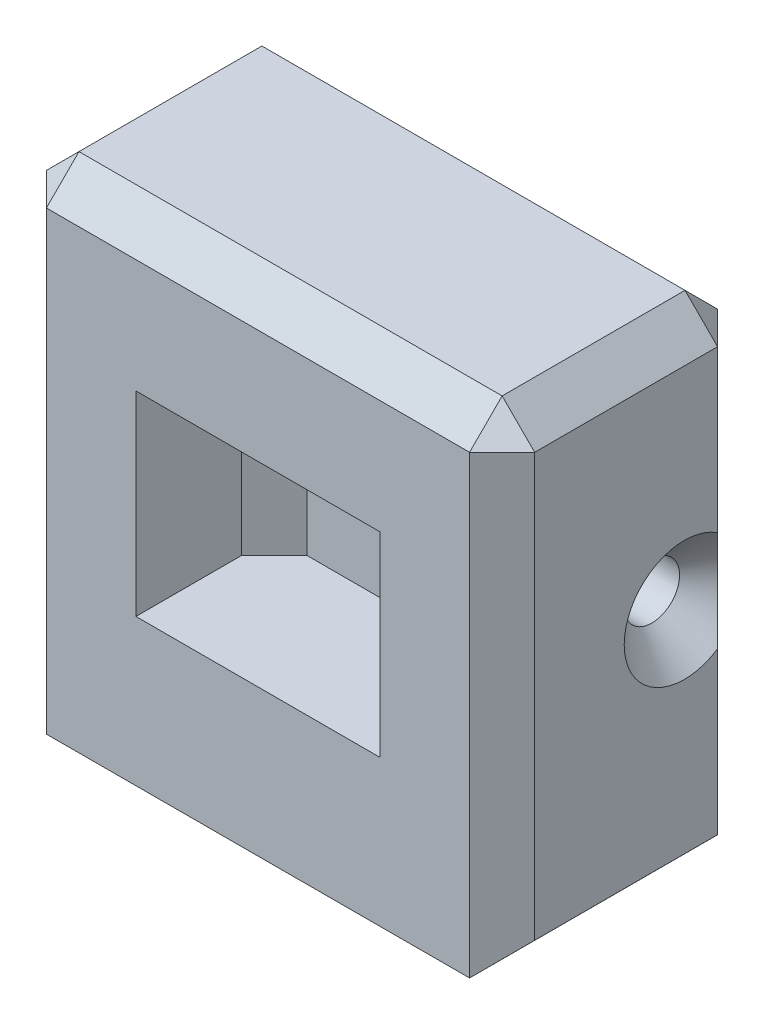
ISO-10303-21;
HEADER;
FILE_DESCRIPTION(('STEP AP214'),'2;1');
FILE_NAME('part.step','',(''),(''),'','','');
FILE_SCHEMA(('AUTOMOTIVE_DESIGN { 1 0 10303 214 1 1 1 1 }'));
ENDSEC;
DATA;
#1=APPLICATION_CONTEXT('core data for automotive mechanical design processes');
#2=APPLICATION_PROTOCOL_DEFINITION('international standard','automotive_design',2000,#1);
#3=PRODUCT_CONTEXT('',#1,'mechanical');
#4=PRODUCT('Part','Part','',(#3));
#5=PRODUCT_RELATED_PRODUCT_CATEGORY('part','',(#4));
#6=PRODUCT_DEFINITION_FORMATION('','',#4);
#7=PRODUCT_DEFINITION_CONTEXT('part definition',#1,'design');
#8=PRODUCT_DEFINITION('design','',#6,#7);
#9=PRODUCT_DEFINITION_SHAPE('','',#8);
#10=(LENGTH_UNIT() NAMED_UNIT(*) SI_UNIT(.MILLI.,.METRE.));
#11=(NAMED_UNIT(*) PLANE_ANGLE_UNIT() SI_UNIT($,.RADIAN.));
#12=(NAMED_UNIT(*) SI_UNIT($,.STERADIAN.) SOLID_ANGLE_UNIT());
#13=UNCERTAINTY_MEASURE_WITH_UNIT(LENGTH_MEASURE(1.E-05),#10,'distance_accuracy_value','');
#14=(GEOMETRIC_REPRESENTATION_CONTEXT(3) GLOBAL_UNCERTAINTY_ASSIGNED_CONTEXT((#13)) GLOBAL_UNIT_ASSIGNED_CONTEXT((#10,
#11,#12)) REPRESENTATION_CONTEXT('',''));
#15=CARTESIAN_POINT('',(0.,0.,0.));
#16=DIRECTION('',(0.,0.,1.));
#17=DIRECTION('',(1.,0.,0.));
#18=AXIS2_PLACEMENT_3D('',#15,#16,#17);
#19=CARTESIAN_POINT('',(12.7,72.39,-22.184499954));
#20=DIRECTION('',(0.,1.,0.));
#21=DIRECTION('',(0.,0.,1.));
#22=AXIS2_PLACEMENT_3D('',#19,#20,#21);
#23=PLANE('',#22);
#24=DIRECTION('',(0.,0.,1.));
#25=VECTOR('',#24,1.);
#26=CARTESIAN_POINT('',(-3.80999999999998,72.39,21.59));
#27=LINE('',#26,#25);
#28=CARTESIAN_POINT('',(-3.80999999999998,72.39,4.77834388084319));
#29=VERTEX_POINT('',#28);
#30=CARTESIAN_POINT('',(-3.80999999999998,72.39,19.05));
#31=VERTEX_POINT('',#30);
#32=EDGE_CURVE('E59',#29,#31,#27,.T.);
#33=ORIENTED_EDGE('',*,*,#32,.T.);
#34=DIRECTION('',(1.,0.,0.));
#35=VECTOR('',#34,1.);
#36=CARTESIAN_POINT('',(31.75,72.39,19.05));
#37=LINE('',#36,#35);
#38=CARTESIAN_POINT('',(29.21,72.39,19.05));
#39=VERTEX_POINT('',#38);
#40=EDGE_CURVE('E11',#31,#39,#37,.T.);
#41=ORIENTED_EDGE('',*,*,#40,.T.);
#42=DIRECTION('',(0.,0.,-1.));
#43=VECTOR('',#42,1.);
#44=CARTESIAN_POINT('',(29.21,72.39,2.23834388084317));
#45=LINE('',#44,#43);
#46=CARTESIAN_POINT('',(29.21,72.39,4.77834388084319));
#47=VERTEX_POINT('',#46);
#48=EDGE_CURVE('E417',#39,#47,#45,.T.);
#49=ORIENTED_EDGE('',*,*,#48,.T.);
#50=DIRECTION('',(-1.,0.,0.));
#51=VECTOR('',#50,1.);
#52=CARTESIAN_POINT('',(12.7,72.39,4.77834388084319));
#53=LINE('',#52,#51);
#54=EDGE_CURVE('E70',#47,#29,#53,.T.);
#55=ORIENTED_EDGE('',*,*,#54,.T.);
#56=EDGE_LOOP('',(#33,#41,#49,#55));
#57=FACE_BOUND('',#56,.T.);
#58=ADVANCED_FACE('F48',(#57),#23,.T.);
#59=CARTESIAN_POINT('',(31.75,0.,0.));
#60=DIRECTION('',(-1.,0.,0.));
#61=DIRECTION('',(0.,0.,1.));
#62=AXIS2_PLACEMENT_3D('',#59,#60,#61);
#63=PLANE('',#62);
#64=DIRECTION('',(0.,0.,-1.));
#65=VECTOR('',#64,1.);
#66=CARTESIAN_POINT('',(31.75,36.8695550611985,0.));
#67=LINE('',#66,#65);
#68=CARTESIAN_POINT('',(31.75,36.8695550611985,19.05));
#69=VERTEX_POINT('',#68);
#70=CARTESIAN_POINT('',(31.75,36.8695550611985,4.77834388084317));
#71=VERTEX_POINT('',#70);
#72=EDGE_CURVE('E388',#69,#71,#67,.T.);
#73=ORIENTED_EDGE('',*,*,#72,.T.);
#74=DIRECTION('',(0.,1.,0.));
#75=VECTOR('',#74,1.);
#76=CARTESIAN_POINT('',(31.75,72.39,4.77834388084317));
#77=LINE('',#76,#75);
#78=CARTESIAN_POINT('',(31.75,49.4362143078983,4.77834388084317));
#79=VERTEX_POINT('',#78);
#80=EDGE_CURVE('E392',#71,#79,#77,.T.);
#81=ORIENTED_EDGE('',*,*,#80,.T.);
#82=CARTESIAN_POINT('',(31.75,53.3585397417437,7.366));
#83=DIRECTION('',(-1.,0.,0.));
#84=DIRECTION('',(0.,0.,1.));
#85=AXIS2_PLACEMENT_3D('',#82,#83,#84);
#86=CIRCLE('',#85,4.69900000000002);
#87=CARTESIAN_POINT('',(31.75,53.3585397417437,12.065));
#88=VERTEX_POINT('',#87);
#89=EDGE_CURVE('E385',#79,#88,#86,.T.);
#90=ORIENTED_EDGE('',*,*,#89,.T.);
#91=CARTESIAN_POINT('',(31.75,53.3585397417437,7.366));
#92=DIRECTION('',(-1.,0.,0.));
#93=DIRECTION('',(0.,0.,1.));
#94=AXIS2_PLACEMENT_3D('',#91,#92,#93);
#95=CIRCLE('',#94,4.69900000000002);
#96=CARTESIAN_POINT('',(31.75,57.2808651755891,4.77834388084317));
#97=VERTEX_POINT('',#96);
#98=EDGE_CURVE('E382',#88,#97,#95,.T.);
#99=ORIENTED_EDGE('',*,*,#98,.T.);
#100=DIRECTION('',(0.,1.,0.));
#101=VECTOR('',#100,1.);
#102=CARTESIAN_POINT('',(31.75,72.39,4.77834388084317));
#103=LINE('',#102,#101);
#104=CARTESIAN_POINT('',(31.75,69.85,4.77834388084317));
#105=VERTEX_POINT('',#104);
#106=EDGE_CURVE('E376',#97,#105,#103,.T.);
#107=ORIENTED_EDGE('',*,*,#106,.T.);
#108=DIRECTION('',(0.,0.,1.));
#109=VECTOR('',#108,1.);
#110=CARTESIAN_POINT('',(31.75,69.85,21.59));
#111=LINE('',#110,#109);
#112=CARTESIAN_POINT('',(31.75,69.85,19.05));
#113=VERTEX_POINT('',#112);
#114=EDGE_CURVE('E373',#105,#113,#111,.T.);
#115=ORIENTED_EDGE('',*,*,#114,.T.);
#116=DIRECTION('',(0.,-1.,0.));
#117=VECTOR('',#116,1.);
#118=CARTESIAN_POINT('',(31.75,0.,19.05));
#119=LINE('',#118,#117);
#120=EDGE_CURVE('E379',#113,#69,#119,.T.);
#121=ORIENTED_EDGE('',*,*,#120,.T.);
#122=EDGE_LOOP('',(#73,#81,#90,#99,#107,#115,#121));
#123=FACE_BOUND('',#122,.T.);
#124=ADVANCED_FACE('F564',(#123),#63,.F.);
#125=CARTESIAN_POINT('',(-6.35,0.,0.));
#126=DIRECTION('',(1.,0.,0.));
#127=DIRECTION('',(0.,0.,-1.));
#128=AXIS2_PLACEMENT_3D('',#125,#126,#127);
#129=PLANE('',#128);
#130=CARTESIAN_POINT('',(-6.35,53.3585397417437,7.366));
#131=DIRECTION('',(1.,0.,0.));
#132=DIRECTION('',(0.,0.,-1.));
#133=AXIS2_PLACEMENT_3D('',#130,#131,#132);
#134=CIRCLE('',#133,4.69899999999999);
#135=CARTESIAN_POINT('',(-6.35,57.2808651755891,4.77834388084319));
#136=VERTEX_POINT('',#135);
#137=CARTESIAN_POINT('',(-6.35,49.4362143078983,4.77834388084319));
#138=VERTEX_POINT('',#137);
#139=EDGE_CURVE('E359',#136,#138,#134,.T.);
#140=ORIENTED_EDGE('',*,*,#139,.T.);
#141=DIRECTION('',(0.,-1.,0.));
#142=VECTOR('',#141,1.);
#143=CARTESIAN_POINT('',(-6.35,34.29,4.77834388084319));
#144=LINE('',#143,#142);
#145=CARTESIAN_POINT('',(-6.35,36.83,4.77834388084319));
#146=VERTEX_POINT('',#145);
#147=EDGE_CURVE('E366',#138,#146,#144,.T.);
#148=ORIENTED_EDGE('',*,*,#147,.T.);
#149=DIRECTION('',(0.,0.,1.));
#150=VECTOR('',#149,1.);
#151=CARTESIAN_POINT('',(-6.35,36.83,0.));
#152=LINE('',#151,#150);
#153=CARTESIAN_POINT('',(-6.35,36.83,19.05));
#154=VERTEX_POINT('',#153);
#155=EDGE_CURVE('E362',#146,#154,#152,.T.);
#156=ORIENTED_EDGE('',*,*,#155,.T.);
#157=DIRECTION('',(0.,1.,0.));
#158=VECTOR('',#157,1.);
#159=CARTESIAN_POINT('',(-6.35,0.,19.05));
#160=LINE('',#159,#158);
#161=CARTESIAN_POINT('',(-6.35,69.85,19.05));
#162=VERTEX_POINT('',#161);
#163=EDGE_CURVE('E356',#154,#162,#160,.T.);
#164=ORIENTED_EDGE('',*,*,#163,.T.);
#165=DIRECTION('',(0.,0.,-1.));
#166=VECTOR('',#165,1.);
#167=CARTESIAN_POINT('',(-6.35,69.85,2.23834388084317));
#168=LINE('',#167,#166);
#169=CARTESIAN_POINT('',(-6.35,69.85,4.77834388084319));
#170=VERTEX_POINT('',#169);
#171=EDGE_CURVE('E350',#162,#170,#168,.T.);
#172=ORIENTED_EDGE('',*,*,#171,.T.);
#173=DIRECTION('',(0.,-1.,0.));
#174=VECTOR('',#173,1.);
#175=CARTESIAN_POINT('',(-6.35,34.29,4.77834388084319));
#176=LINE('',#175,#174);
#177=EDGE_CURVE('E353',#170,#136,#176,.T.);
#178=ORIENTED_EDGE('',*,*,#177,.T.);
#179=EDGE_LOOP('',(#140,#148,#156,#164,#172,#178));
#180=FACE_BOUND('',#179,.T.);
#181=ADVANCED_FACE('F632',(#180),#129,.F.);
#182=CARTESIAN_POINT('',(31.75,34.3270794834874,21.59));
#183=DIRECTION('',(-0.000973214328807074,0.999999526426823,0.));
#184=DIRECTION('',(-0.999999526426823,-0.000973214328807074,0.));
#185=AXIS2_PLACEMENT_3D('',#182,#183,#184);
#186=PLANE('',#185);
#187=DIRECTION('',(-0.999999526426823,-0.000973214328807074,0.));
#188=VECTOR('',#187,1.);
#189=CARTESIAN_POINT('',(31.75,34.3270794834874,2.23834388084317));
#190=LINE('',#189,#188);
#191=CARTESIAN_POINT('',(29.21,34.3246075179216,2.23834388084317));
#192=VERTEX_POINT('',#191);
#193=CARTESIAN_POINT('',(-3.81000000000001,34.2924719655658,2.23834388084317));
#194=VERTEX_POINT('',#193);
#195=EDGE_CURVE('E333',#192,#194,#190,.T.);
#196=ORIENTED_EDGE('',*,*,#195,.F.);
#197=DIRECTION('',(0.,0.,1.));
#198=VECTOR('',#197,1.);
#199=CARTESIAN_POINT('',(29.2100012028759,34.3246075190922,21.59));
#200=LINE('',#199,#198);
#201=CARTESIAN_POINT('',(29.21,34.3246075179216,21.59));
#202=VERTEX_POINT('',#201);
#203=EDGE_CURVE('E347',#192,#202,#200,.T.);
#204=ORIENTED_EDGE('',*,*,#203,.T.);
#205=DIRECTION('',(0.999999526426823,0.000973214328807074,0.));
#206=VECTOR('',#205,1.);
#207=CARTESIAN_POINT('',(31.75,34.3270794834874,21.59));
#208=LINE('',#207,#206);
#209=CARTESIAN_POINT('',(-3.81,34.2924719655658,21.59));
#210=VERTEX_POINT('',#209);
#211=EDGE_CURVE('E290',#210,#202,#208,.T.);
#212=ORIENTED_EDGE('',*,*,#211,.F.);
#213=DIRECTION('',(0.707106613753083,0.000688166614395999,0.707106613753089));
#214=VECTOR('',#213,1.);
#215=CARTESIAN_POINT('',(-3.82668696254355,34.2924557255671,21.5733130374564));
#216=LINE('',#215,#214);
#217=CARTESIAN_POINT('',(-3.8124695621514,34.2924695621514,21.5875304378486));
#218=VERTEX_POINT('',#217);
#219=EDGE_CURVE('E344',#210,#218,#216,.F.);
#220=ORIENTED_EDGE('',*,*,#219,.T.);
#221=DIRECTION('',(0.,0.,-1.));
#222=VECTOR('',#221,1.);
#223=CARTESIAN_POINT('',(-3.8124695621514,34.2924695621514,21.59));
#224=LINE('',#223,#222);
#225=CARTESIAN_POINT('',(-3.8124695621514,34.2924695621514,2.24081344299458));
#226=VERTEX_POINT('',#225);
#227=EDGE_CURVE('E340',#218,#226,#224,.T.);
#228=ORIENTED_EDGE('',*,*,#227,.T.);
#229=DIRECTION('',(0.707106613753083,0.000688166614395999,-0.707106613753089));
#230=VECTOR('',#229,1.);
#231=CARTESIAN_POINT('',(-3.82668696254355,34.2924557255671,2.25503084338672));
#232=LINE('',#231,#230);
#233=EDGE_CURVE('E337',#226,#194,#232,.T.);
#234=ORIENTED_EDGE('',*,*,#233,.T.);
#235=EDGE_LOOP('',(#196,#204,#212,#220,#228,#234));
#236=FACE_BOUND('',#235,.T.);
#237=ADVANCED_FACE('F643',(#236),#186,.F.);
#238=CARTESIAN_POINT('',(0.,0.,10.795));
#239=DIRECTION('',(0.,0.,-1.));
#240=DIRECTION('',(-1.,0.,0.));
#241=AXIS2_PLACEMENT_3D('',#238,#239,#240);
#242=PLANE('',#241);
#243=DIRECTION('',(1.,0.,0.));
#244=VECTOR('',#243,1.);
#245=CARTESIAN_POINT('',(3.175,45.7385397417437,10.795));
#246=LINE('',#245,#244);
#247=CARTESIAN_POINT('',(5.71500000000003,45.7385397417437,10.795));
#248=VERTEX_POINT('',#247);
#249=CARTESIAN_POINT('',(19.685,45.7385397417437,10.795));
#250=VERTEX_POINT('',#249);
#251=EDGE_CURVE('E267',#248,#250,#246,.T.);
#252=ORIENTED_EDGE('',*,*,#251,.T.);
#253=DIRECTION('',(0.,1.,0.));
#254=VECTOR('',#253,1.);
#255=CARTESIAN_POINT('',(19.685,60.9785397417437,10.795));
#256=LINE('',#255,#254);
#257=CARTESIAN_POINT('',(19.685,60.9785397417437,10.795));
#258=VERTEX_POINT('',#257);
#259=EDGE_CURVE('E320',#250,#258,#256,.T.);
#260=ORIENTED_EDGE('',*,*,#259,.T.);
#261=DIRECTION('',(-1.,0.,0.));
#262=VECTOR('',#261,1.);
#263=CARTESIAN_POINT('',(3.175,60.9785397417437,10.795));
#264=LINE('',#263,#262);
#265=CARTESIAN_POINT('',(5.71500000000003,60.9785397417437,10.795));
#266=VERTEX_POINT('',#265);
#267=EDGE_CURVE('E264',#258,#266,#264,.T.);
#268=ORIENTED_EDGE('',*,*,#267,.T.);
#269=DIRECTION('',(0.,-1.,0.));
#270=VECTOR('',#269,1.);
#271=CARTESIAN_POINT('',(5.71500000000003,45.7385397417437,10.795));
#272=LINE('',#271,#270);
#273=EDGE_CURVE('E302',#266,#248,#272,.T.);
#274=ORIENTED_EDGE('',*,*,#273,.T.);
#275=EDGE_LOOP('',(#252,#260,#268,#274));
#276=FACE_BOUND('',#275,.T.);
#277=DIRECTION('',(0.,1.,0.));
#278=VECTOR('',#277,1.);
#279=CARTESIAN_POINT('',(17.145,50.1835397417437,10.795));
#280=LINE('',#279,#278);
#281=CARTESIAN_POINT('',(17.145,50.1835397417437,10.795));
#282=VERTEX_POINT('',#281);
#283=CARTESIAN_POINT('',(17.145,56.5335397417437,10.795));
#284=VERTEX_POINT('',#283);
#285=EDGE_CURVE('E214',#282,#284,#280,.T.);
#286=ORIENTED_EDGE('',*,*,#285,.F.);
#287=DIRECTION('',(1.,0.,0.));
#288=VECTOR('',#287,1.);
#289=CARTESIAN_POINT('',(8.255,50.1835397417437,10.795));
#290=LINE('',#289,#288);
#291=CARTESIAN_POINT('',(8.255,50.1835397417437,10.795));
#292=VERTEX_POINT('',#291);
#293=EDGE_CURVE('E234',#292,#282,#290,.T.);
#294=ORIENTED_EDGE('',*,*,#293,.F.);
#295=DIRECTION('',(0.,-1.,0.));
#296=VECTOR('',#295,1.);
#297=CARTESIAN_POINT('',(8.255,50.1835397417437,10.795));
#298=LINE('',#297,#296);
#299=CARTESIAN_POINT('',(8.255,56.5335397417437,10.795));
#300=VERTEX_POINT('',#299);
#301=EDGE_CURVE('E238',#300,#292,#298,.T.);
#302=ORIENTED_EDGE('',*,*,#301,.F.);
#303=DIRECTION('',(-1.,0.,0.));
#304=VECTOR('',#303,1.);
#305=CARTESIAN_POINT('',(8.255,56.5335397417437,10.795));
#306=LINE('',#305,#304);
#307=EDGE_CURVE('E249',#284,#300,#306,.T.);
#308=ORIENTED_EDGE('',*,*,#307,.F.);
#309=EDGE_LOOP('',(#286,#294,#302,#308));
#310=FACE_BOUND('',#309,.T.);
#311=ADVANCED_FACE('F648',(#276,#310),#242,.F.);
#312=CARTESIAN_POINT('',(0.,0.,21.59));
#313=DIRECTION('',(0.,0.,-1.));
#314=DIRECTION('',(-1.,0.,0.));
#315=AXIS2_PLACEMENT_3D('',#312,#313,#314);
#316=PLANE('',#315);
#317=DIRECTION('',(-1.,0.,0.));
#318=VECTOR('',#317,1.);
#319=CARTESIAN_POINT('',(3.175,60.9785397417437,21.59));
#320=LINE('',#319,#318);
#321=CARTESIAN_POINT('',(22.225,60.9785397417437,21.59));
#322=VERTEX_POINT('',#321);
#323=CARTESIAN_POINT('',(3.175,60.9785397417437,21.59));
#324=VERTEX_POINT('',#323);
#325=EDGE_CURVE('E276',#322,#324,#320,.T.);
#326=ORIENTED_EDGE('',*,*,#325,.F.);
#327=DIRECTION('',(0.,1.,0.));
#328=VECTOR('',#327,1.);
#329=CARTESIAN_POINT('',(22.225,45.7385397417437,21.59));
#330=LINE('',#329,#328);
#331=CARTESIAN_POINT('',(22.225,45.7385397417437,21.59));
#332=VERTEX_POINT('',#331);
#333=EDGE_CURVE('E257',#332,#322,#330,.T.);
#334=ORIENTED_EDGE('',*,*,#333,.F.);
#335=DIRECTION('',(1.,0.,0.));
#336=VECTOR('',#335,1.);
#337=CARTESIAN_POINT('',(3.175,45.7385397417437,21.59));
#338=LINE('',#337,#336);
#339=CARTESIAN_POINT('',(3.175,45.7385397417437,21.59));
#340=VERTEX_POINT('',#339);
#341=EDGE_CURVE('E268',#340,#332,#338,.T.);
#342=ORIENTED_EDGE('',*,*,#341,.F.);
#343=DIRECTION('',(0.,-1.,0.));
#344=VECTOR('',#343,1.);
#345=CARTESIAN_POINT('',(3.175,45.7385397417437,21.59));
#346=LINE('',#345,#344);
#347=EDGE_CURVE('E280',#324,#340,#346,.T.);
#348=ORIENTED_EDGE('',*,*,#347,.F.);
#349=EDGE_LOOP('',(#326,#334,#342,#348));
#350=FACE_BOUND('',#349,.T.);
#351=DIRECTION('',(-1.,0.,0.));
#352=VECTOR('',#351,1.);
#353=CARTESIAN_POINT('',(-6.35,69.85,21.59));
#354=LINE('',#353,#352);
#355=CARTESIAN_POINT('',(29.21,69.85,21.59));
#356=VERTEX_POINT('',#355);
#357=CARTESIAN_POINT('',(-3.81,69.85,21.59));
#358=VERTEX_POINT('',#357);
#359=EDGE_CURVE('E399',#356,#358,#354,.T.);
#360=ORIENTED_EDGE('',*,*,#359,.T.);
#361=DIRECTION('',(0.,-1.,0.));
#362=VECTOR('',#361,1.);
#363=CARTESIAN_POINT('',(-3.81,0.,21.59));
#364=LINE('',#363,#362);
#365=EDGE_CURVE('E405',#358,#210,#364,.T.);
#366=ORIENTED_EDGE('',*,*,#365,.T.);
#367=ORIENTED_EDGE('',*,*,#211,.T.);
#368=DIRECTION('',(0.,1.,0.));
#369=VECTOR('',#368,1.);
#370=CARTESIAN_POINT('',(29.21,0.,21.59));
#371=LINE('',#370,#369);
#372=EDGE_CURVE('E402',#202,#356,#371,.T.);
#373=ORIENTED_EDGE('',*,*,#372,.T.);
#374=EDGE_LOOP('',(#360,#366,#367,#373));
#375=FACE_BOUND('',#374,.T.);
#376=ADVANCED_FACE('F645',(#350,#375),#316,.F.);
#377=CARTESIAN_POINT('',(22.225,45.7385397417437,10.795));
#378=DIRECTION('',(1.,0.,0.));
#379=DIRECTION('',(0.,0.,-1.));
#380=AXIS2_PLACEMENT_3D('',#377,#378,#379);
#381=PLANE('',#380);
#382=DIRECTION('',(0.,0.,1.));
#383=VECTOR('',#382,1.);
#384=CARTESIAN_POINT('',(22.225,60.9785397417437,10.795));
#385=LINE('',#384,#383);
#386=CARTESIAN_POINT('',(22.225,60.9785397417437,13.335));
#387=VERTEX_POINT('',#386);
#388=EDGE_CURVE('E272',#387,#322,#385,.T.);
#389=ORIENTED_EDGE('',*,*,#388,.F.);
#390=DIRECTION('',(0.,-1.,0.));
#391=VECTOR('',#390,1.);
#392=CARTESIAN_POINT('',(22.225,45.7385397417437,13.335));
#393=LINE('',#392,#391);
#394=CARTESIAN_POINT('',(22.225,45.7385397417437,13.335));
#395=VERTEX_POINT('',#394);
#396=EDGE_CURVE('E327',#387,#395,#393,.T.);
#397=ORIENTED_EDGE('',*,*,#396,.T.);
#398=DIRECTION('',(0.,0.,1.));
#399=VECTOR('',#398,1.);
#400=CARTESIAN_POINT('',(22.225,45.7385397417437,10.795));
#401=LINE('',#400,#399);
#402=EDGE_CURVE('E287',#395,#332,#401,.T.);
#403=ORIENTED_EDGE('',*,*,#402,.T.);
#404=ORIENTED_EDGE('',*,*,#333,.T.);
#405=EDGE_LOOP('',(#389,#397,#403,#404));
#406=FACE_BOUND('',#405,.T.);
#407=ADVANCED_FACE('F647',(#406),#381,.F.);
#408=CARTESIAN_POINT('',(3.175,45.7385397417437,10.795));
#409=DIRECTION('',(0.,-1.,0.));
#410=DIRECTION('',(0.,0.,-1.));
#411=AXIS2_PLACEMENT_3D('',#408,#409,#410);
#412=PLANE('',#411);
#413=ORIENTED_EDGE('',*,*,#402,.F.);
#414=DIRECTION('',(0.707106781186551,0.,0.707106781186544));
#415=VECTOR('',#414,1.);
#416=CARTESIAN_POINT('',(19.685,45.7385397417437,10.795));
#417=LINE('',#416,#415);
#418=EDGE_CURVE('E330',#395,#250,#417,.F.);
#419=ORIENTED_EDGE('',*,*,#418,.T.);
#420=ORIENTED_EDGE('',*,*,#251,.F.);
#421=DIRECTION('',(0.707106781186551,0.,-0.707106781186544));
#422=VECTOR('',#421,1.);
#423=CARTESIAN_POINT('',(5.71500000000003,45.7385397417437,10.795));
#424=LINE('',#423,#422);
#425=CARTESIAN_POINT('',(3.175,45.7385397417437,13.335));
#426=VERTEX_POINT('',#425);
#427=EDGE_CURVE('E310',#248,#426,#424,.F.);
#428=ORIENTED_EDGE('',*,*,#427,.T.);
#429=DIRECTION('',(0.,0.,1.));
#430=VECTOR('',#429,1.);
#431=CARTESIAN_POINT('',(3.175,45.7385397417437,10.795));
#432=LINE('',#431,#430);
#433=EDGE_CURVE('E291',#426,#340,#432,.T.);
#434=ORIENTED_EDGE('',*,*,#433,.T.);
#435=ORIENTED_EDGE('',*,*,#341,.T.);
#436=EDGE_LOOP('',(#413,#419,#420,#428,#434,#435));
#437=FACE_BOUND('',#436,.T.);
#438=ADVANCED_FACE('F655',(#437),#412,.F.);
#439=CARTESIAN_POINT('',(3.175,45.7385397417437,10.795));
#440=DIRECTION('',(-1.,0.,0.));
#441=DIRECTION('',(0.,0.,1.));
#442=AXIS2_PLACEMENT_3D('',#439,#440,#441);
#443=PLANE('',#442);
#444=ORIENTED_EDGE('',*,*,#433,.F.);
#445=DIRECTION('',(0.,1.,0.));
#446=VECTOR('',#445,1.);
#447=CARTESIAN_POINT('',(3.175,60.9785397417437,13.335));
#448=LINE('',#447,#446);
#449=CARTESIAN_POINT('',(3.175,60.9785397417437,13.335));
#450=VERTEX_POINT('',#449);
#451=EDGE_CURVE('E313',#426,#450,#448,.T.);
#452=ORIENTED_EDGE('',*,*,#451,.T.);
#453=DIRECTION('',(0.,0.,1.));
#454=VECTOR('',#453,1.);
#455=CARTESIAN_POINT('',(3.175,60.9785397417437,10.795));
#456=LINE('',#455,#454);
#457=EDGE_CURVE('E294',#450,#324,#456,.T.);
#458=ORIENTED_EDGE('',*,*,#457,.T.);
#459=ORIENTED_EDGE('',*,*,#347,.T.);
#460=EDGE_LOOP('',(#444,#452,#458,#459));
#461=FACE_BOUND('',#460,.T.);
#462=ADVANCED_FACE('F827',(#461),#443,.F.);
#463=CARTESIAN_POINT('',(3.175,60.9785397417437,10.795));
#464=DIRECTION('',(0.,1.,0.));
#465=DIRECTION('',(0.,0.,1.));
#466=AXIS2_PLACEMENT_3D('',#463,#464,#465);
#467=PLANE('',#466);
#468=ORIENTED_EDGE('',*,*,#267,.F.);
#469=DIRECTION('',(-0.707106781186551,0.,-0.707106781186544));
#470=VECTOR('',#469,1.);
#471=CARTESIAN_POINT('',(19.685,60.9785397417437,10.795));
#472=LINE('',#471,#470);
#473=EDGE_CURVE('E324',#258,#387,#472,.F.);
#474=ORIENTED_EDGE('',*,*,#473,.T.);
#475=ORIENTED_EDGE('',*,*,#388,.T.);
#476=ORIENTED_EDGE('',*,*,#325,.T.);
#477=ORIENTED_EDGE('',*,*,#457,.F.);
#478=DIRECTION('',(-0.707106781186551,0.,0.707106781186544));
#479=VECTOR('',#478,1.);
#480=CARTESIAN_POINT('',(5.71500000000003,60.9785397417437,10.795));
#481=LINE('',#480,#479);
#482=EDGE_CURVE('E316',#450,#266,#481,.F.);
#483=ORIENTED_EDGE('',*,*,#482,.T.);
#484=EDGE_LOOP('',(#468,#474,#475,#476,#477,#483));
#485=FACE_BOUND('',#484,.T.);
#486=ADVANCED_FACE('F819',(#485),#467,.F.);
#487=CARTESIAN_POINT('',(17.145,50.1835397417437,2.413));
#488=DIRECTION('',(1.,0.,0.));
#489=DIRECTION('',(0.,0.,-1.));
#490=AXIS2_PLACEMENT_3D('',#487,#488,#489);
#491=PLANE('',#490);
#492=CARTESIAN_POINT('',(17.145,53.3585397417437,7.366));
#493=DIRECTION('',(1.,0.,0.));
#494=DIRECTION('',(0.,0.,-1.));
#495=AXIS2_PLACEMENT_3D('',#492,#493,#494);
#496=CIRCLE('',#495,2.159);
#497=CARTESIAN_POINT('',(17.145,53.3585397417437,5.207));
#498=VERTEX_POINT('',#497);
#499=EDGE_CURVE('E241',#498,#498,#496,.T.);
#500=ORIENTED_EDGE('',*,*,#499,.T.);
#501=EDGE_LOOP('',(#500));
#502=FACE_BOUND('',#501,.T.);
#503=ORIENTED_EDGE('',*,*,#285,.T.);
#504=DIRECTION('',(0.,0.,1.));
#505=VECTOR('',#504,1.);
#506=CARTESIAN_POINT('',(17.145,56.5335397417437,2.413));
#507=LINE('',#506,#505);
#508=CARTESIAN_POINT('',(17.145,56.5335397417437,2.413));
#509=VERTEX_POINT('',#508);
#510=EDGE_CURVE('E207',#509,#284,#507,.T.);
#511=ORIENTED_EDGE('',*,*,#510,.F.);
#512=DIRECTION('',(0.,1.,0.));
#513=VECTOR('',#512,1.);
#514=CARTESIAN_POINT('',(17.145,50.1835397417437,2.413));
#515=LINE('',#514,#513);
#516=CARTESIAN_POINT('',(17.145,50.1835397417437,2.413));
#517=VERTEX_POINT('',#516);
#518=EDGE_CURVE('E211',#517,#509,#515,.T.);
#519=ORIENTED_EDGE('',*,*,#518,.F.);
#520=DIRECTION('',(0.,0.,1.));
#521=VECTOR('',#520,1.);
#522=CARTESIAN_POINT('',(17.145,50.1835397417437,2.413));
#523=LINE('',#522,#521);
#524=EDGE_CURVE('E254',#517,#282,#523,.T.);
#525=ORIENTED_EDGE('',*,*,#524,.T.);
#526=EDGE_LOOP('',(#503,#511,#519,#525));
#527=FACE_BOUND('',#526,.T.);
#528=ADVANCED_FACE('F209',(#502,#527),#491,.F.);
#529=CARTESIAN_POINT('',(8.255,50.1835397417437,2.413));
#530=DIRECTION('',(0.,-1.,0.));
#531=DIRECTION('',(0.,0.,-1.));
#532=AXIS2_PLACEMENT_3D('',#529,#530,#531);
#533=PLANE('',#532);
#534=ORIENTED_EDGE('',*,*,#293,.T.);
#535=ORIENTED_EDGE('',*,*,#524,.F.);
#536=DIRECTION('',(1.,0.,0.));
#537=VECTOR('',#536,1.);
#538=CARTESIAN_POINT('',(8.255,50.1835397417437,2.413));
#539=LINE('',#538,#537);
#540=CARTESIAN_POINT('',(8.255,50.1835397417437,2.413));
#541=VERTEX_POINT('',#540);
#542=EDGE_CURVE('E220',#541,#517,#539,.T.);
#543=ORIENTED_EDGE('',*,*,#542,.F.);
#544=DIRECTION('',(0.,0.,1.));
#545=VECTOR('',#544,1.);
#546=CARTESIAN_POINT('',(8.255,50.1835397417437,2.413));
#547=LINE('',#546,#545);
#548=EDGE_CURVE('E258',#541,#292,#547,.T.);
#549=ORIENTED_EDGE('',*,*,#548,.T.);
#550=EDGE_LOOP('',(#534,#535,#543,#549));
#551=FACE_BOUND('',#550,.T.);
#552=ADVANCED_FACE('F804',(#551),#533,.F.);
#553=CARTESIAN_POINT('',(8.255,50.1835397417437,2.413));
#554=DIRECTION('',(-1.,0.,0.));
#555=DIRECTION('',(0.,0.,1.));
#556=AXIS2_PLACEMENT_3D('',#553,#554,#555);
#557=PLANE('',#556);
#558=CARTESIAN_POINT('',(8.255,53.3585397417437,7.366));
#559=DIRECTION('',(-1.,0.,0.));
#560=DIRECTION('',(0.,0.,1.));
#561=AXIS2_PLACEMENT_3D('',#558,#559,#560);
#562=CIRCLE('',#561,2.159);
#563=CARTESIAN_POINT('',(8.255,53.3585397417437,9.525));
#564=VERTEX_POINT('',#563);
#565=EDGE_CURVE('E303',#564,#564,#562,.T.);
#566=ORIENTED_EDGE('',*,*,#565,.T.);
#567=EDGE_LOOP('',(#566));
#568=FACE_BOUND('',#567,.T.);
#569=ORIENTED_EDGE('',*,*,#301,.T.);
#570=ORIENTED_EDGE('',*,*,#548,.F.);
#571=DIRECTION('',(0.,-1.,0.));
#572=VECTOR('',#571,1.);
#573=CARTESIAN_POINT('',(8.255,50.1835397417437,2.413));
#574=LINE('',#573,#572);
#575=CARTESIAN_POINT('',(8.255,56.5335397417437,2.413));
#576=VERTEX_POINT('',#575);
#577=EDGE_CURVE('E229',#576,#541,#574,.T.);
#578=ORIENTED_EDGE('',*,*,#577,.F.);
#579=DIRECTION('',(0.,0.,1.));
#580=VECTOR('',#579,1.);
#581=CARTESIAN_POINT('',(8.255,56.5335397417437,2.413));
#582=LINE('',#581,#580);
#583=EDGE_CURVE('E219',#576,#300,#582,.T.);
#584=ORIENTED_EDGE('',*,*,#583,.T.);
#585=EDGE_LOOP('',(#569,#570,#578,#584));
#586=FACE_BOUND('',#585,.T.);
#587=ADVANCED_FACE('F797',(#568,#586),#557,.F.);
#588=CARTESIAN_POINT('',(8.255,56.5335397417437,2.413));
#589=DIRECTION('',(0.,1.,0.));
#590=DIRECTION('',(0.,0.,1.));
#591=AXIS2_PLACEMENT_3D('',#588,#589,#590);
#592=PLANE('',#591);
#593=ORIENTED_EDGE('',*,*,#307,.T.);
#594=ORIENTED_EDGE('',*,*,#583,.F.);
#595=DIRECTION('',(-1.,0.,0.));
#596=VECTOR('',#595,1.);
#597=CARTESIAN_POINT('',(8.255,56.5335397417437,2.413));
#598=LINE('',#597,#596);
#599=EDGE_CURVE('E223',#509,#576,#598,.T.);
#600=ORIENTED_EDGE('',*,*,#599,.F.);
#601=ORIENTED_EDGE('',*,*,#510,.T.);
#602=EDGE_LOOP('',(#593,#594,#600,#601));
#603=FACE_BOUND('',#602,.T.);
#604=ADVANCED_FACE('F224',(#603),#592,.F.);
#605=CARTESIAN_POINT('',(0.,0.,2.413));
#606=DIRECTION('',(0.,0.,-1.));
#607=DIRECTION('',(-1.,0.,0.));
#608=AXIS2_PLACEMENT_3D('',#605,#606,#607);
#609=PLANE('',#608);
#610=ORIENTED_EDGE('',*,*,#518,.T.);
#611=ORIENTED_EDGE('',*,*,#599,.T.);
#612=ORIENTED_EDGE('',*,*,#577,.T.);
#613=ORIENTED_EDGE('',*,*,#542,.T.);
#614=EDGE_LOOP('',(#610,#611,#612,#613));
#615=FACE_BOUND('',#614,.T.);
#616=ADVANCED_FACE('F231',(#615),#609,.F.);
#617=CARTESIAN_POINT('',(37.856574162327,53.3585397417437,7.366));
#618=DIRECTION('',(-1.,0.,0.));
#619=DIRECTION('',(0.,0.,1.));
#620=AXIS2_PLACEMENT_3D('',#617,#618,#619);
#621=CYLINDRICAL_SURFACE('',#620,2.159);
#622=CARTESIAN_POINT('',(-3.80999999999999,53.3585397417437,7.366));
#623=DIRECTION('',(1.,0.,0.));
#624=DIRECTION('',(0.,0.,-1.));
#625=AXIS2_PLACEMENT_3D('',#622,#623,#624);
#626=CIRCLE('',#625,2.159);
#627=CARTESIAN_POINT('',(-3.80999999999999,53.3585397417437,5.207));
#628=VERTEX_POINT('',#627);
#629=EDGE_CURVE('E369',#628,#628,#626,.F.);
#630=ORIENTED_EDGE('',*,*,#629,.T.);
#631=EDGE_LOOP('',(#630));
#632=FACE_BOUND('',#631,.T.);
#633=ORIENTED_EDGE('',*,*,#565,.F.);
#634=EDGE_LOOP('',(#633));
#635=FACE_BOUND('',#634,.T.);
#636=ADVANCED_FACE('F777',(#632,#635),#621,.F.);
#637=CARTESIAN_POINT('',(29.21,53.3585397417437,7.366));
#638=DIRECTION('',(-1.,0.,0.));
#639=DIRECTION('',(0.,0.,1.));
#640=AXIS2_PLACEMENT_3D('',#637,#638,#639);
#641=CIRCLE('',#640,2.159);
#642=CARTESIAN_POINT('',(29.21,53.3585397417437,9.525));
#643=VERTEX_POINT('',#642);
#644=EDGE_CURVE('E395',#643,#643,#641,.F.);
#645=ORIENTED_EDGE('',*,*,#644,.T.);
#646=EDGE_LOOP('',(#645));
#647=FACE_BOUND('',#646,.T.);
#648=ORIENTED_EDGE('',*,*,#499,.F.);
#649=EDGE_LOOP('',(#648));
#650=FACE_BOUND('',#649,.T.);
#651=ADVANCED_FACE('F678',(#647,#650),#621,.F.);
#652=CARTESIAN_POINT('',(5.71500000000003,0.,10.795));
#653=DIRECTION('',(0.707106781186544,0.,0.707106781186551));
#654=DIRECTION('',(0.,1.,0.));
#655=AXIS2_PLACEMENT_3D('',#652,#653,#654);
#656=PLANE('',#655);
#657=ORIENTED_EDGE('',*,*,#482,.F.);
#658=ORIENTED_EDGE('',*,*,#451,.F.);
#659=ORIENTED_EDGE('',*,*,#427,.F.);
#660=ORIENTED_EDGE('',*,*,#273,.F.);
#661=EDGE_LOOP('',(#657,#658,#659,#660));
#662=FACE_BOUND('',#661,.T.);
#663=ADVANCED_FACE('F671',(#662),#656,.T.);
#664=CARTESIAN_POINT('',(19.685,0.,10.795));
#665=DIRECTION('',(-0.707106781186544,0.,0.707106781186551));
#666=DIRECTION('',(0.,-1.,0.));
#667=AXIS2_PLACEMENT_3D('',#664,#665,#666);
#668=PLANE('',#667);
#669=ORIENTED_EDGE('',*,*,#418,.F.);
#670=ORIENTED_EDGE('',*,*,#396,.F.);
#671=ORIENTED_EDGE('',*,*,#473,.F.);
#672=ORIENTED_EDGE('',*,*,#259,.F.);
#673=EDGE_LOOP('',(#669,#670,#671,#672));
#674=FACE_BOUND('',#673,.T.);
#675=ADVANCED_FACE('F677',(#674),#668,.T.);
#676=CARTESIAN_POINT('',(0.,0.,2.23834388084317));
#677=DIRECTION('',(0.,0.,-1.));
#678=DIRECTION('',(-1.,0.,0.));
#679=AXIS2_PLACEMENT_3D('',#676,#677,#678);
#680=PLANE('',#679);
#681=ORIENTED_EDGE('',*,*,#195,.T.);
#682=DIRECTION('',(0.,1.,0.));
#683=VECTOR('',#682,1.);
#684=CARTESIAN_POINT('',(-3.81,72.39,2.23834388084317));
#685=LINE('',#684,#683);
#686=CARTESIAN_POINT('',(-3.81,69.85,2.23834388084317));
#687=VERTEX_POINT('',#686);
#688=EDGE_CURVE('E414',#194,#687,#685,.T.);
#689=ORIENTED_EDGE('',*,*,#688,.T.);
#690=DIRECTION('',(1.,0.,0.));
#691=VECTOR('',#690,1.);
#692=CARTESIAN_POINT('',(0.,69.85,2.23834388084317));
#693=LINE('',#692,#691);
#694=CARTESIAN_POINT('',(29.21,69.85,2.23834388084317));
#695=VERTEX_POINT('',#694);
#696=EDGE_CURVE('E408',#687,#695,#693,.T.);
#697=ORIENTED_EDGE('',*,*,#696,.T.);
#698=DIRECTION('',(0.,-1.,0.));
#699=VECTOR('',#698,1.);
#700=CARTESIAN_POINT('',(29.21,34.3270794834874,2.23834388084317));
#701=LINE('',#700,#699);
#702=EDGE_CURVE('E411',#695,#192,#701,.T.);
#703=ORIENTED_EDGE('',*,*,#702,.T.);
#704=EDGE_LOOP('',(#681,#689,#697,#703));
#705=FACE_BOUND('',#704,.T.);
#706=ADVANCED_FACE('F683',(#705),#680,.T.);
#707=CARTESIAN_POINT('',(31.75,36.8695550611985,0.));
#708=DIRECTION('',(-0.707794612771187,0.706418279868299,0.));
#709=DIRECTION('',(0.,0.,-1.));
#710=AXIS2_PLACEMENT_3D('',#707,#708,#709);
#711=PLANE('',#710);
#712=DIRECTION('',(0.576975314046158,0.578099449889619,0.576975314046153));
#713=VECTOR('',#712,1.);
#714=CARTESIAN_POINT('',(17.7610580562726,22.8533581021036,-9.21059806288408));
#715=LINE('',#714,#713);
#716=EDGE_CURVE('E544',#71,#192,#715,.F.);
#717=ORIENTED_EDGE('',*,*,#716,.F.);
#718=ORIENTED_EDGE('',*,*,#72,.F.);
#719=DIRECTION('',(0.576975314046158,0.578099449889619,-0.576975314046153));
#720=VECTOR('',#719,1.);
#721=CARTESIAN_POINT('',(17.7610580562726,22.8533581021036,33.0389419437273));
#722=LINE('',#721,#720);
#723=EDGE_CURVE('E53',#202,#69,#722,.T.);
#724=ORIENTED_EDGE('',*,*,#723,.F.);
#725=ORIENTED_EDGE('',*,*,#203,.F.);
#726=EDGE_LOOP('',(#717,#718,#724,#725));
#727=FACE_BOUND('',#726,.T.);
#728=ADVANCED_FACE('F51',(#727),#711,.F.);
#729=CARTESIAN_POINT('',(29.21,53.3585397417437,7.366));
#730=DIRECTION('',(1.,0.,0.));
#731=DIRECTION('',(0.,0.,-1.));
#732=AXIS2_PLACEMENT_3D('',#729,#730,#731);
#733=CONICAL_SURFACE('',#732,2.159,0.785398163397449);
#734=ORIENTED_EDGE('',*,*,#644,.F.);
#735=EDGE_LOOP('',(#734));
#736=FACE_BOUND('',#735,.T.);
#737=ORIENTED_EDGE('',*,*,#98,.F.);
#738=ORIENTED_EDGE('',*,*,#89,.F.);
#739=CARTESIAN_POINT('',(31.7502,49.4358427777356,4.77854388084317));
#740=CARTESIAN_POINT('',(31.6507999972249,49.620549013708,4.67914387806808));
#741=CARTESIAN_POINT('',(31.5556953295295,49.8101974264701,4.58403921037272));
#742=CARTESIAN_POINT('',(31.376077099945,50.2004199782627,4.40442098078818));
#743=CARTESIAN_POINT('',(31.2916120570137,50.4010385811456,4.3199559378569));
#744=CARTESIAN_POINT('',(31.1353848079487,50.8147564001229,4.16372868879192));
#745=CARTESIAN_POINT('',(31.0637636895645,51.0279636251707,4.09210757040769));
#746=CARTESIAN_POINT('',(30.9374066893303,51.4638675066345,3.96575057017352));
#747=CARTESIAN_POINT('',(30.8826388688949,51.6865452920271,3.91098274973808));
#748=CARTESIAN_POINT('',(30.8090547853484,52.0574507445037,3.83739866619157));
#749=CARTESIAN_POINT('',(30.7844036044314,52.2033894275469,3.81274748527456));
#750=CARTESIAN_POINT('',(30.7436951939953,52.4976832586512,3.77203907483852));
#751=CARTESIAN_POINT('',(30.7276383600737,52.6460385176235,3.75598224091692));
#752=CARTESIAN_POINT('',(30.7046629805001,52.9431616097291,3.73300686134326));
#753=CARTESIAN_POINT('',(30.6976841792991,53.0919200861354,3.72602806014228));
#754=CARTESIAN_POINT('',(30.692873589331,53.3897307174878,3.72121747017422));
#755=CARTESIAN_POINT('',(30.6950414777498,53.538782861884,3.72338535859299));
#756=CARTESIAN_POINT('',(30.7084554678268,53.835989556751,3.73679934867002));
#757=CARTESIAN_POINT('',(30.7196972093419,53.9841445039,3.74804109018505));
#758=CARTESIAN_POINT('',(30.7509257518067,54.2785923683968,3.77926963264993));
#759=CARTESIAN_POINT('',(30.7709129501452,54.4248852008204,3.79925683098838));
#760=CARTESIAN_POINT('',(30.8192449562561,54.7156417905986,3.84758883709925));
#761=CARTESIAN_POINT('',(30.8476417699639,54.8600881520907,3.87598565080705));
#762=CARTESIAN_POINT('',(30.912048567048,55.1455160789904,3.94039244789117));
#763=CARTESIAN_POINT('',(30.9480584300999,55.286497699119,3.9764023109431));
#764=CARTESIAN_POINT('',(31.0350329925606,55.5931047261304,4.06337687340374));
#765=CARTESIAN_POINT('',(31.0875501684515,55.7578482703284,4.11589404929468));
#766=CARTESIAN_POINT('',(31.2012233771102,56.0812800827342,4.22956725795334));
#767=CARTESIAN_POINT('',(31.2623823373965,56.2399662757001,4.29072621823969));
#768=CARTESIAN_POINT('',(31.3912779404404,56.5492301624639,4.4196218212836));
#769=CARTESIAN_POINT('',(31.4589244404364,56.6998835751173,4.48726832127956));
#770=CARTESIAN_POINT('',(31.6002666221024,56.9950505163794,4.62861050294558));
#771=CARTESIAN_POINT('',(31.6739519589839,57.1395739269239,4.70229583982712));
#772=CARTESIAN_POINT('',(31.7502,57.2812367057518,4.77854388084317));
#773=B_SPLINE_CURVE_WITH_KNOTS('',3,(#739,#740,#741,#742,#743,#744,#745,#746,#747,#748,#749,
#750,#751,#752,#753,#754,#755,#756,#757,#758,#759,#760,#761,#762,#763,#764,#765,#766,#767,#768,
#769,#770,#771,#772),.UNSPECIFIED.,.F.,.F.,(4,2,2,2,2,2,2,2,2,2,2,2,2,2,2,2,4),(0.,
0.696596913010746,1.39626353755231,2.10319907387504,2.80878653092867,3.25846963651528,
3.70817343921714,4.15487683483147,4.60156446507378,5.04803758188027,5.49453098827929,
5.94384536152917,6.39315263388826,6.93469087643314,7.4764130140056,8.01147300632842,
8.54563484483729),.UNSPECIFIED.);
#774=EDGE_CURVE('E536',#97,#79,#773,.F.);
#775=ORIENTED_EDGE('',*,*,#774,.F.);
#776=EDGE_LOOP('',(#737,#738,#775));
#777=FACE_BOUND('',#776,.T.);
#778=ADVANCED_FACE('F524',(#736,#777),#733,.F.);
#779=CARTESIAN_POINT('',(29.21,0.,21.59));
#780=DIRECTION('',(-0.707106781186545,0.,-0.70710678118655));
#781=DIRECTION('',(0.,1.,0.));
#782=AXIS2_PLACEMENT_3D('',#779,#780,#781);
#783=PLANE('',#782);
#784=ORIENTED_EDGE('',*,*,#723,.T.);
#785=ORIENTED_EDGE('',*,*,#120,.F.);
#786=DIRECTION('',(-0.70710678118655,0.,0.707106781186545));
#787=VECTOR('',#786,1.);
#788=CARTESIAN_POINT('',(29.21,69.85,21.59));
#789=LINE('',#788,#787);
#790=EDGE_CURVE('E580',#356,#113,#789,.F.);
#791=ORIENTED_EDGE('',*,*,#790,.F.);
#792=ORIENTED_EDGE('',*,*,#372,.F.);
#793=EDGE_LOOP('',(#784,#785,#791,#792));
#794=FACE_BOUND('',#793,.T.);
#795=ADVANCED_FACE('F531',(#794),#783,.F.);
#796=CARTESIAN_POINT('',(29.21,0.,2.23834388084317));
#797=DIRECTION('',(0.707106781186545,0.,-0.70710678118655));
#798=DIRECTION('',(0.,1.,0.));
#799=AXIS2_PLACEMENT_3D('',#796,#797,#798);
#800=PLANE('',#799);
#801=ORIENTED_EDGE('',*,*,#716,.T.);
#802=ORIENTED_EDGE('',*,*,#702,.F.);
#803=DIRECTION('',(-0.70710678118655,0.,-0.707106781186545));
#804=VECTOR('',#803,1.);
#805=CARTESIAN_POINT('',(31.75,69.85,4.77834388084317));
#806=LINE('',#805,#804);
#807=EDGE_CURVE('E577',#105,#695,#806,.T.);
#808=ORIENTED_EDGE('',*,*,#807,.F.);
#809=ORIENTED_EDGE('',*,*,#106,.F.);
#810=ORIENTED_EDGE('',*,*,#774,.T.);
#811=ORIENTED_EDGE('',*,*,#80,.F.);
#812=EDGE_LOOP('',(#801,#802,#808,#809,#810,#811));
#813=FACE_BOUND('',#812,.T.);
#814=ADVANCED_FACE('F522',(#813),#800,.T.);
#815=CARTESIAN_POINT('',(31.75,69.85,0.));
#816=DIRECTION('',(0.707106781186545,0.70710678118655,0.));
#817=DIRECTION('',(0.,0.,-1.));
#818=AXIS2_PLACEMENT_3D('',#815,#816,#817);
#819=PLANE('',#818);
#820=DIRECTION('',(-0.70710678118655,0.707106781186545,0.));
#821=VECTOR('',#820,1.);
#822=CARTESIAN_POINT('',(30.48,71.12,19.05));
#823=LINE('',#822,#821);
#824=EDGE_CURVE('E545',#113,#39,#823,.T.);
#825=ORIENTED_EDGE('',*,*,#824,.F.);
#826=ORIENTED_EDGE('',*,*,#114,.F.);
#827=DIRECTION('',(0.70710678118655,-0.707106781186545,0.));
#828=VECTOR('',#827,1.);
#829=CARTESIAN_POINT('',(31.75,69.85,4.77834388084317));
#830=LINE('',#829,#828);
#831=EDGE_CURVE('E572',#47,#105,#830,.T.);
#832=ORIENTED_EDGE('',*,*,#831,.F.);
#833=ORIENTED_EDGE('',*,*,#48,.F.);
#834=EDGE_LOOP('',(#825,#826,#832,#833));
#835=FACE_BOUND('',#834,.T.);
#836=ADVANCED_FACE('F515',(#835),#819,.T.);
#837=CARTESIAN_POINT('',(29.21,69.85,21.59));
#838=DIRECTION('',(0.577350269189621,0.577350269189631,0.577350269189626));
#839=DIRECTION('',(0.,-0.707106781186544,0.707106781186551));
#840=AXIS2_PLACEMENT_3D('',#837,#838,#839);
#841=PLANE('',#840);
#842=ORIENTED_EDGE('',*,*,#790,.T.);
#843=ORIENTED_EDGE('',*,*,#824,.T.);
#844=DIRECTION('',(0.,-0.707106781186544,0.707106781186551));
#845=VECTOR('',#844,1.);
#846=CARTESIAN_POINT('',(29.21,69.85,21.59));
#847=LINE('',#846,#845);
#848=EDGE_CURVE('E584',#356,#39,#847,.F.);
#849=ORIENTED_EDGE('',*,*,#848,.F.);
#850=EDGE_LOOP('',(#842,#843,#849));
#851=FACE_BOUND('',#850,.T.);
#852=ADVANCED_FACE('F508',(#851),#841,.T.);
#853=CARTESIAN_POINT('',(31.75,69.85,4.77834388084317));
#854=DIRECTION('',(0.577350269189621,0.57735026918963,-0.577350269189626));
#855=DIRECTION('',(0.,0.707106781186545,0.70710678118655));
#856=AXIS2_PLACEMENT_3D('',#853,#854,#855);
#857=PLANE('',#856);
#858=ORIENTED_EDGE('',*,*,#831,.T.);
#859=ORIENTED_EDGE('',*,*,#807,.T.);
#860=DIRECTION('',(0.,-0.707106781186545,-0.70710678118655));
#861=VECTOR('',#860,1.);
#862=CARTESIAN_POINT('',(29.21,71.12,3.50834388084318));
#863=LINE('',#862,#861);
#864=EDGE_CURVE('E582',#47,#695,#863,.T.);
#865=ORIENTED_EDGE('',*,*,#864,.F.);
#866=EDGE_LOOP('',(#858,#859,#865));
#867=FACE_BOUND('',#866,.T.);
#868=ADVANCED_FACE('F501',(#867),#857,.T.);
#869=CARTESIAN_POINT('',(0.,69.85,21.59));
#870=DIRECTION('',(0.,0.707106781186551,0.707106781186544));
#871=DIRECTION('',(1.,0.,0.));
#872=AXIS2_PLACEMENT_3D('',#869,#870,#871);
#873=PLANE('',#872);
#874=ORIENTED_EDGE('',*,*,#848,.T.);
#875=ORIENTED_EDGE('',*,*,#40,.F.);
#876=DIRECTION('',(0.,0.707106781186544,-0.707106781186551));
#877=VECTOR('',#876,1.);
#878=CARTESIAN_POINT('',(-3.80999999999999,71.12,20.32));
#879=LINE('',#878,#877);
#880=EDGE_CURVE('E596',#358,#31,#879,.T.);
#881=ORIENTED_EDGE('',*,*,#880,.F.);
#882=ORIENTED_EDGE('',*,*,#359,.F.);
#883=EDGE_LOOP('',(#874,#875,#881,#882));
#884=FACE_BOUND('',#883,.T.);
#885=ADVANCED_FACE('F494',(#884),#873,.T.);
#886=CARTESIAN_POINT('',(12.7,72.39,4.77834388084319));
#887=DIRECTION('',(0.,-0.70710678118655,0.707106781186545));
#888=DIRECTION('',(-1.,0.,0.));
#889=AXIS2_PLACEMENT_3D('',#886,#887,#888);
#890=PLANE('',#889);
#891=ORIENTED_EDGE('',*,*,#864,.T.);
#892=ORIENTED_EDGE('',*,*,#696,.F.);
#893=DIRECTION('',(0.,0.707106781186545,0.70710678118655));
#894=VECTOR('',#893,1.);
#895=CARTESIAN_POINT('',(-3.81,69.85,2.23834388084317));
#896=LINE('',#895,#894);
#897=EDGE_CURVE('E609',#29,#687,#896,.F.);
#898=ORIENTED_EDGE('',*,*,#897,.F.);
#899=ORIENTED_EDGE('',*,*,#54,.F.);
#900=EDGE_LOOP('',(#891,#892,#898,#899));
#901=FACE_BOUND('',#900,.T.);
#902=ADVANCED_FACE('F487',(#901),#890,.F.);
#903=CARTESIAN_POINT('',(-6.35,69.85,0.));
#904=DIRECTION('',(-0.707106781186544,0.707106781186551,0.));
#905=DIRECTION('',(0.,0.,1.));
#906=AXIS2_PLACEMENT_3D('',#903,#904,#905);
#907=PLANE('',#906);
#908=DIRECTION('',(-0.707106781186551,-0.707106781186544,0.));
#909=VECTOR('',#908,1.);
#910=CARTESIAN_POINT('',(-6.35,69.85,19.05));
#911=LINE('',#910,#909);
#912=EDGE_CURVE('E600',#31,#162,#911,.T.);
#913=ORIENTED_EDGE('',*,*,#912,.F.);
#914=ORIENTED_EDGE('',*,*,#32,.F.);
#915=DIRECTION('',(0.707106781186551,0.707106781186544,0.));
#916=VECTOR('',#915,1.);
#917=CARTESIAN_POINT('',(-5.07999999999999,71.12,4.77834388084319));
#918=LINE('',#917,#916);
#919=EDGE_CURVE('E613',#170,#29,#918,.T.);
#920=ORIENTED_EDGE('',*,*,#919,.F.);
#921=ORIENTED_EDGE('',*,*,#171,.F.);
#922=EDGE_LOOP('',(#913,#914,#920,#921));
#923=FACE_BOUND('',#922,.T.);
#924=ADVANCED_FACE('F480',(#923),#907,.T.);
#925=CARTESIAN_POINT('',(-6.35,69.85,19.05));
#926=DIRECTION('',(-0.577350269189625,0.577350269189631,0.577350269189621));
#927=DIRECTION('',(-0.707106781186551,-0.707106781186544,0.));
#928=AXIS2_PLACEMENT_3D('',#925,#926,#927);
#929=PLANE('',#928);
#930=ORIENTED_EDGE('',*,*,#880,.T.);
#931=ORIENTED_EDGE('',*,*,#912,.T.);
#932=DIRECTION('',(-0.707106781186545,0.,-0.70710678118655));
#933=VECTOR('',#932,1.);
#934=CARTESIAN_POINT('',(-6.35,69.85,19.05));
#935=LINE('',#934,#933);
#936=EDGE_CURVE('E606',#358,#162,#935,.T.);
#937=ORIENTED_EDGE('',*,*,#936,.F.);
#938=EDGE_LOOP('',(#930,#931,#937));
#939=FACE_BOUND('',#938,.T.);
#940=ADVANCED_FACE('F473',(#939),#929,.T.);
#941=CARTESIAN_POINT('',(-3.81,69.85,2.23834388084317));
#942=DIRECTION('',(-0.577350269189626,0.577350269189631,-0.577350269189621));
#943=DIRECTION('',(-0.707106781186551,-0.707106781186544,0.));
#944=AXIS2_PLACEMENT_3D('',#941,#942,#943);
#945=PLANE('',#944);
#946=ORIENTED_EDGE('',*,*,#919,.T.);
#947=ORIENTED_EDGE('',*,*,#897,.T.);
#948=DIRECTION('',(-0.707106781186545,0.,0.70710678118655));
#949=VECTOR('',#948,1.);
#950=CARTESIAN_POINT('',(-3.81,69.85,2.23834388084317));
#951=LINE('',#950,#949);
#952=EDGE_CURVE('E440',#170,#687,#951,.F.);
#953=ORIENTED_EDGE('',*,*,#952,.F.);
#954=EDGE_LOOP('',(#946,#947,#953));
#955=FACE_BOUND('',#954,.T.);
#956=ADVANCED_FACE('F467',(#955),#945,.T.);
#957=CARTESIAN_POINT('',(-6.35,53.3585397417437,7.366));
#958=DIRECTION('',(-1.,0.,0.));
#959=DIRECTION('',(0.,0.,1.));
#960=AXIS2_PLACEMENT_3D('',#957,#958,#959);
#961=CONICAL_SURFACE('',#960,4.69899999999999,0.785398163397446);
#962=ORIENTED_EDGE('',*,*,#629,.F.);
#963=EDGE_LOOP('',(#962));
#964=FACE_BOUND('',#963,.T.);
#965=CARTESIAN_POINT('',(-6.3502,57.2812367057517,4.77854388084319));
#966=CARTESIAN_POINT('',(-6.25079999722491,57.0965304697794,4.67914387806811));
#967=CARTESIAN_POINT('',(-6.15569532952955,56.9068820570173,4.58403921037274));
#968=CARTESIAN_POINT('',(-5.97607709994501,56.5166595052247,4.4044209807882));
#969=CARTESIAN_POINT('',(-5.89161205701373,56.3160409023418,4.31995593785692));
#970=CARTESIAN_POINT('',(-5.73538480794875,55.9023230833645,4.16372868879194));
#971=CARTESIAN_POINT('',(-5.66376368956452,55.6891158583167,4.09210757040771));
#972=CARTESIAN_POINT('',(-5.53740668933035,55.2532119768529,3.96575057017354));
#973=CARTESIAN_POINT('',(-5.48263886889491,55.0305341914603,3.9109827497381));
#974=CARTESIAN_POINT('',(-5.4090547853484,54.6596287389837,3.83739866619159));
#975=CARTESIAN_POINT('',(-5.38440360443139,54.5136900559406,3.81274748527458));
#976=CARTESIAN_POINT('',(-5.34369519399534,54.2193962248362,3.77203907483853));
#977=CARTESIAN_POINT('',(-5.32763836007375,54.0710409658639,3.75598224091693));
#978=CARTESIAN_POINT('',(-5.30466298050008,53.7739178737583,3.73300686134327));
#979=CARTESIAN_POINT('',(-5.29768417929911,53.625159397352,3.72602806014229));
#980=CARTESIAN_POINT('',(-5.29287358933104,53.3273487659996,3.72121747017423));
#981=CARTESIAN_POINT('',(-5.29504147774982,53.1782966216034,3.72338535859301));
#982=CARTESIAN_POINT('',(-5.30845546782684,52.8810899267364,3.73679934867003));
#983=CARTESIAN_POINT('',(-5.31969720934188,52.7329349795875,3.74804109018506));
#984=CARTESIAN_POINT('',(-5.35092575180675,52.4384871150906,3.77926963264994));
#985=CARTESIAN_POINT('',(-5.3709129501452,52.292194282667,3.79925683098839));
#986=CARTESIAN_POINT('',(-5.41924495625607,52.0014376928888,3.84758883709926));
#987=CARTESIAN_POINT('',(-5.44764176996387,51.8569913313967,3.87598565080706));
#988=CARTESIAN_POINT('',(-5.51204856704799,51.571563404497,3.94039244789118));
#989=CARTESIAN_POINT('',(-5.54805843009992,51.4305817843684,3.97640231094311));
#990=CARTESIAN_POINT('',(-5.63503299256057,51.123974757357,4.06337687340375));
#991=CARTESIAN_POINT('',(-5.6875501684515,50.9592312131591,4.11589404929469));
#992=CARTESIAN_POINT('',(-5.80122337711016,50.6357994007532,4.22956725795335));
#993=CARTESIAN_POINT('',(-5.86238233739651,50.4771132077873,4.2907262182397));
#994=CARTESIAN_POINT('',(-5.99127794044043,50.1678493210235,4.41962182128362));
#995=CARTESIAN_POINT('',(-6.05892444043638,50.0171959083701,4.48726832127957));
#996=CARTESIAN_POINT('',(-6.2002666221024,49.722028967108,4.62861050294559));
#997=CARTESIAN_POINT('',(-6.27395195898394,49.5775055565635,4.70229583982714));
#998=CARTESIAN_POINT('',(-6.3502,49.4358427777357,4.77854388084319));
#999=B_SPLINE_CURVE_WITH_KNOTS('',3,(#965,#966,#967,#968,#969,#970,#971,#972,#973,#974,#975,
#976,#977,#978,#979,#980,#981,#982,#983,#984,#985,#986,#987,#988,#989,#990,#991,#992,#993,#994,
#995,#996,#997,#998),.UNSPECIFIED.,.F.,.F.,(4,2,2,2,2,2,2,2,2,2,2,2,2,2,2,2,4),(0.,
0.696596913010732,1.3962635375523,2.10319907387502,2.80878653092865,3.25846963651526,
3.70817343921711,4.15487683483146,4.60156446507375,5.04803758188023,5.49453098827925,
5.94384536152912,6.39315263388821,6.9346908764331,7.47641301400556,8.01147300632839,
8.54563484483725),.UNSPECIFIED.);
#1000=EDGE_CURVE('E430',#138,#136,#999,.F.);
#1001=ORIENTED_EDGE('',*,*,#1000,.F.);
#1002=ORIENTED_EDGE('',*,*,#139,.F.);
#1003=EDGE_LOOP('',(#1001,#1002));
#1004=FACE_BOUND('',#1003,.T.);
#1005=ADVANCED_FACE('F443',(#964,#1004),#961,.F.);
#1006=CARTESIAN_POINT('',(-3.81,0.,21.59));
#1007=DIRECTION('',(0.70710678118655,0.,-0.707106781186545));
#1008=DIRECTION('',(0.,-1.,0.));
#1009=AXIS2_PLACEMENT_3D('',#1006,#1007,#1008);
#1010=PLANE('',#1009);
#1011=ORIENTED_EDGE('',*,*,#936,.T.);
#1012=ORIENTED_EDGE('',*,*,#163,.F.);
#1013=DIRECTION('',(0.577350269189624,-0.577350269189625,0.577350269189628));
#1014=VECTOR('',#1013,1.);
#1015=CARTESIAN_POINT('',(7.61999999999995,22.86,33.02));
#1016=LINE('',#1015,#1014);
#1017=EDGE_CURVE('E427',#218,#154,#1016,.F.);
#1018=ORIENTED_EDGE('',*,*,#1017,.F.);
#1019=ORIENTED_EDGE('',*,*,#219,.F.);
#1020=ORIENTED_EDGE('',*,*,#365,.F.);
#1021=EDGE_LOOP('',(#1011,#1012,#1018,#1019,#1020));
#1022=FACE_BOUND('',#1021,.T.);
#1023=ADVANCED_FACE('F459',(#1022),#1010,.F.);
#1024=CARTESIAN_POINT('',(-3.81,0.,2.23834388084317));
#1025=DIRECTION('',(-0.70710678118655,0.,-0.707106781186545));
#1026=DIRECTION('',(0.,-1.,0.));
#1027=AXIS2_PLACEMENT_3D('',#1024,#1025,#1026);
#1028=PLANE('',#1027);
#1029=ORIENTED_EDGE('',*,*,#688,.F.);
#1030=ORIENTED_EDGE('',*,*,#233,.F.);
#1031=DIRECTION('',(0.577350269189624,-0.577350269189625,-0.577350269189628));
#1032=VECTOR('',#1031,1.);
#1033=CARTESIAN_POINT('',(7.61999999999995,22.86,-9.19165611915687));
#1034=LINE('',#1033,#1032);
#1035=EDGE_CURVE('E424',#146,#226,#1034,.T.);
#1036=ORIENTED_EDGE('',*,*,#1035,.F.);
#1037=ORIENTED_EDGE('',*,*,#147,.F.);
#1038=ORIENTED_EDGE('',*,*,#1000,.T.);
#1039=ORIENTED_EDGE('',*,*,#177,.F.);
#1040=ORIENTED_EDGE('',*,*,#952,.T.);
#1041=EDGE_LOOP('',(#1029,#1030,#1036,#1037,#1038,#1039,#1040));
#1042=FACE_BOUND('',#1041,.T.);
#1043=ADVANCED_FACE('F452',(#1042),#1028,.T.);
#1044=CARTESIAN_POINT('',(-3.8124695621514,34.2924695621514,21.59));
#1045=DIRECTION('',(0.707106781186549,0.707106781186546,0.));
#1046=DIRECTION('',(0.,0.,-1.));
#1047=AXIS2_PLACEMENT_3D('',#1044,#1045,#1046);
#1048=PLANE('',#1047);
#1049=ORIENTED_EDGE('',*,*,#1017,.T.);
#1050=ORIENTED_EDGE('',*,*,#155,.F.);
#1051=ORIENTED_EDGE('',*,*,#1035,.T.);
#1052=ORIENTED_EDGE('',*,*,#227,.F.);
#1053=EDGE_LOOP('',(#1049,#1050,#1051,#1052));
#1054=FACE_BOUND('',#1053,.T.);
#1055=ADVANCED_FACE('F458',(#1054),#1048,.F.);
#1056=CLOSED_SHELL('',(#58,#124,#181,#237,#311,#376,#407,#438,#462,#486,#528,#552,#587,#604,
#616,#636,#651,#663,#675,#706,#728,#778,#795,#814,#836,#852,#868,#885,#902,#924,#940,#956,#1005,
#1023,#1043,#1055));
#1057=MANIFOLD_SOLID_BREP('B2',#1056);
#1058=ADVANCED_BREP_SHAPE_REPRESENTATION('',(#18,#1057),#14);
#1059=SHAPE_DEFINITION_REPRESENTATION(#9,#1058);
ENDSEC;
END-ISO-10303-21;
